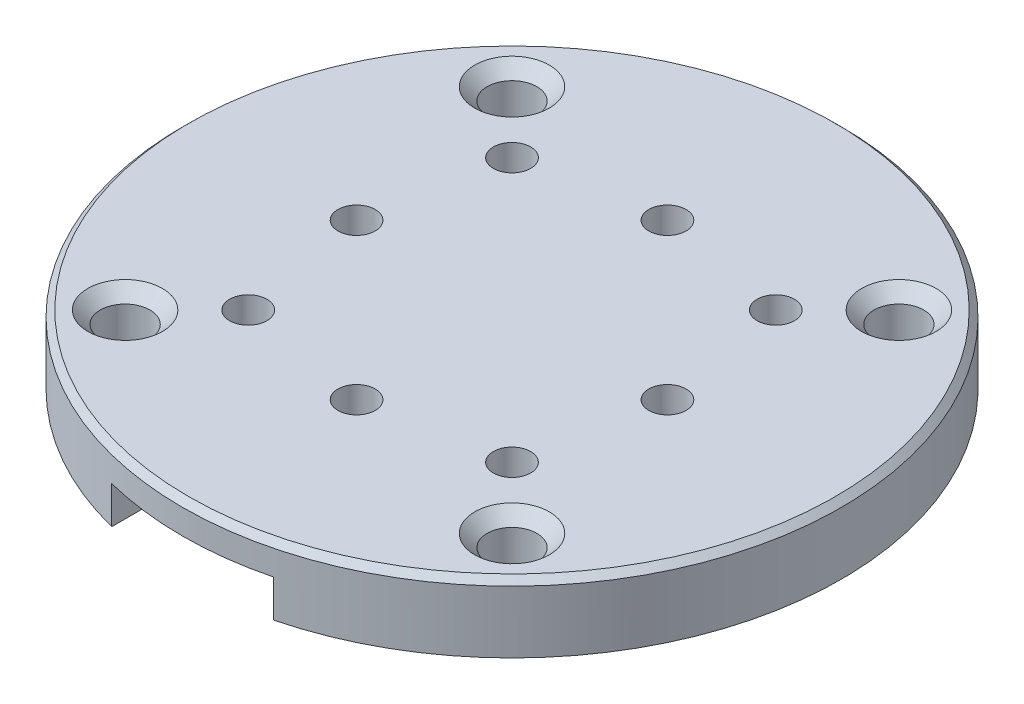
ISO-10303-21;
HEADER;
FILE_DESCRIPTION(('STEP AP214'),'2;1');
FILE_NAME('part.step','',(''),(''),'','','');
FILE_SCHEMA(('AUTOMOTIVE_DESIGN { 1 0 10303 214 1 1 1 1 }'));
ENDSEC;
DATA;
#1=APPLICATION_CONTEXT('core data for automotive mechanical design processes');
#2=APPLICATION_PROTOCOL_DEFINITION('international standard','automotive_design',2000,#1);
#3=PRODUCT_CONTEXT('',#1,'mechanical');
#4=PRODUCT('Part','Part','',(#3));
#5=PRODUCT_RELATED_PRODUCT_CATEGORY('part','',(#4));
#6=PRODUCT_DEFINITION_FORMATION('','',#4);
#7=PRODUCT_DEFINITION_CONTEXT('part definition',#1,'design');
#8=PRODUCT_DEFINITION('design','',#6,#7);
#9=PRODUCT_DEFINITION_SHAPE('','',#8);
#10=(LENGTH_UNIT() NAMED_UNIT(*) SI_UNIT(.MILLI.,.METRE.));
#11=(NAMED_UNIT(*) PLANE_ANGLE_UNIT() SI_UNIT($,.RADIAN.));
#12=(NAMED_UNIT(*) SI_UNIT($,.STERADIAN.) SOLID_ANGLE_UNIT());
#13=UNCERTAINTY_MEASURE_WITH_UNIT(LENGTH_MEASURE(1.E-05),#10,'distance_accuracy_value','');
#14=(GEOMETRIC_REPRESENTATION_CONTEXT(3) GLOBAL_UNCERTAINTY_ASSIGNED_CONTEXT((#13)) GLOBAL_UNIT_ASSIGNED_CONTEXT((#10,
#11,#12)) REPRESENTATION_CONTEXT('',''));
#15=CARTESIAN_POINT('',(0.,0.,0.));
#16=DIRECTION('',(0.,0.,1.));
#17=DIRECTION('',(1.,0.,0.));
#18=AXIS2_PLACEMENT_3D('',#15,#16,#17);
#19=CARTESIAN_POINT('',(0.,0.,12.5));
#20=DIRECTION('',(0.,1.,0.));
#21=DIRECTION('',(0.,0.,1.));
#22=AXIS2_PLACEMENT_3D('',#19,#20,#21);
#23=CYLINDRICAL_SURFACE('',#22,1.5);
#24=CARTESIAN_POINT('',(0.,5.5,12.5));
#25=DIRECTION('',(0.,1.,0.));
#26=DIRECTION('',(0.,0.,1.));
#27=AXIS2_PLACEMENT_3D('',#24,#25,#26);
#28=CIRCLE('',#27,1.5);
#29=CARTESIAN_POINT('',(0.,5.5,14.));
#30=VERTEX_POINT('',#29);
#31=EDGE_CURVE('E125',#30,#30,#28,.T.);
#32=ORIENTED_EDGE('',*,*,#31,.T.);
#33=EDGE_LOOP('',(#32));
#34=FACE_BOUND('',#33,.T.);
#35=CARTESIAN_POINT('',(0.,3.,12.5));
#36=DIRECTION('',(0.,-1.,0.));
#37=DIRECTION('',(0.,0.,-1.));
#38=AXIS2_PLACEMENT_3D('',#35,#36,#37);
#39=CIRCLE('',#38,1.5);
#40=CARTESIAN_POINT('',(0.,3.,11.));
#41=VERTEX_POINT('',#40);
#42=EDGE_CURVE('E43',#41,#41,#39,.F.);
#43=ORIENTED_EDGE('',*,*,#42,.F.);
#44=EDGE_LOOP('',(#43));
#45=FACE_BOUND('',#44,.T.);
#46=ADVANCED_FACE('F39',(#34,#45),#23,.F.);
#47=CARTESIAN_POINT('',(0.,5.5,0.));
#48=DIRECTION('',(0.,-1.,0.));
#49=DIRECTION('',(0.,0.,-1.));
#50=AXIS2_PLACEMENT_3D('',#47,#48,#49);
#51=CYLINDRICAL_SURFACE('',#50,26.5);
#52=CARTESIAN_POINT('',(0.,0.,0.));
#53=DIRECTION('',(0.,1.,0.));
#54=DIRECTION('',(0.,0.,1.));
#55=AXIS2_PLACEMENT_3D('',#52,#53,#54);
#56=CIRCLE('',#55,26.5);
#57=CARTESIAN_POINT('',(6.5,0.,25.6904651573303));
#58=VERTEX_POINT('',#57);
#59=CARTESIAN_POINT('',(-6.5,0.,25.6904651573303));
#60=VERTEX_POINT('',#59);
#61=EDGE_CURVE('E176',#58,#60,#56,.T.);
#62=ORIENTED_EDGE('',*,*,#61,.T.);
#63=DIRECTION('',(0.,-1.,0.));
#64=VECTOR('',#63,1.);
#65=CARTESIAN_POINT('',(-6.5,3.,25.6904651573303));
#66=LINE('',#65,#64);
#67=CARTESIAN_POINT('',(-6.5,3.,25.6904651573303));
#68=VERTEX_POINT('',#67);
#69=EDGE_CURVE('E94',#68,#60,#66,.T.);
#70=ORIENTED_EDGE('',*,*,#69,.F.);
#71=CARTESIAN_POINT('',(0.,3.,0.));
#72=DIRECTION('',(0.,-1.,0.));
#73=DIRECTION('',(0.,0.,-1.));
#74=AXIS2_PLACEMENT_3D('',#71,#72,#73);
#75=CIRCLE('',#74,26.5);
#76=CARTESIAN_POINT('',(6.5,3.,25.6904651573303));
#77=VERTEX_POINT('',#76);
#78=EDGE_CURVE('E100',#77,#68,#75,.T.);
#79=ORIENTED_EDGE('',*,*,#78,.F.);
#80=DIRECTION('',(0.,-1.,0.));
#81=VECTOR('',#80,1.);
#82=CARTESIAN_POINT('',(6.5,3.,25.6904651573303));
#83=LINE('',#82,#81);
#84=EDGE_CURVE('E83',#77,#58,#83,.T.);
#85=ORIENTED_EDGE('',*,*,#84,.T.);
#86=EDGE_LOOP('',(#62,#70,#79,#85));
#87=FACE_BOUND('',#86,.T.);
#88=CARTESIAN_POINT('',(0.,4.99999999999998,0.));
#89=DIRECTION('',(0.,1.,0.));
#90=DIRECTION('',(0.,0.,1.));
#91=AXIS2_PLACEMENT_3D('',#88,#89,#90);
#92=CIRCLE('',#91,26.5);
#93=CARTESIAN_POINT('',(0.,4.99999999999998,26.5));
#94=VERTEX_POINT('',#93);
#95=EDGE_CURVE('E181',#94,#94,#92,.F.);
#96=ORIENTED_EDGE('',*,*,#95,.T.);
#97=EDGE_LOOP('',(#96));
#98=FACE_BOUND('',#97,.T.);
#99=ADVANCED_FACE('F104',(#87,#98),#51,.T.);
#100=CARTESIAN_POINT('',(0.,5.5,0.));
#101=DIRECTION('',(0.,1.,0.));
#102=DIRECTION('',(0.,0.,1.));
#103=AXIS2_PLACEMENT_3D('',#100,#101,#102);
#104=PLANE('',#103);
#105=CARTESIAN_POINT('',(10.6066017177982,5.5,-10.6066017177982));
#106=DIRECTION('',(0.,1.,0.));
#107=DIRECTION('',(0.,0.,1.));
#108=AXIS2_PLACEMENT_3D('',#105,#106,#107);
#109=CIRCLE('',#108,1.5);
#110=CARTESIAN_POINT('',(10.6066017177982,5.5,-9.10660171779819));
#111=VERTEX_POINT('',#110);
#112=EDGE_CURVE('E139',#111,#111,#109,.T.);
#113=ORIENTED_EDGE('',*,*,#112,.F.);
#114=EDGE_LOOP('',(#113));
#115=FACE_BOUND('',#114,.T.);
#116=CARTESIAN_POINT('',(10.6066017177982,5.5,10.6066017177982));
#117=DIRECTION('',(0.,1.,0.));
#118=DIRECTION('',(0.,0.,1.));
#119=AXIS2_PLACEMENT_3D('',#116,#117,#118);
#120=CIRCLE('',#119,1.49999999999964);
#121=CARTESIAN_POINT('',(10.6066017177982,5.5,12.1066017177979));
#122=VERTEX_POINT('',#121);
#123=EDGE_CURVE('E145',#122,#122,#120,.T.);
#124=ORIENTED_EDGE('',*,*,#123,.F.);
#125=EDGE_LOOP('',(#124));
#126=FACE_BOUND('',#125,.T.);
#127=CARTESIAN_POINT('',(-10.6066017177982,5.5,10.6066017177982));
#128=DIRECTION('',(0.,1.,0.));
#129=DIRECTION('',(0.,0.,1.));
#130=AXIS2_PLACEMENT_3D('',#127,#128,#129);
#131=CIRCLE('',#130,1.49999999999898);
#132=CARTESIAN_POINT('',(-10.6066017177982,5.5,12.1066017177972));
#133=VERTEX_POINT('',#132);
#134=EDGE_CURVE('E151',#133,#133,#131,.T.);
#135=ORIENTED_EDGE('',*,*,#134,.F.);
#136=EDGE_LOOP('',(#135));
#137=FACE_BOUND('',#136,.T.);
#138=CARTESIAN_POINT('',(-10.6066017177982,5.5,-10.6066017177982));
#139=DIRECTION('',(0.,1.,0.));
#140=DIRECTION('',(0.,0.,1.));
#141=AXIS2_PLACEMENT_3D('',#138,#139,#140);
#142=CIRCLE('',#141,1.49999999999933);
#143=CARTESIAN_POINT('',(-10.6066017177982,5.5,-9.10660171779889));
#144=VERTEX_POINT('',#143);
#145=EDGE_CURVE('E121',#144,#144,#142,.T.);
#146=ORIENTED_EDGE('',*,*,#145,.F.);
#147=EDGE_LOOP('',(#146));
#148=FACE_BOUND('',#147,.T.);
#149=CARTESIAN_POINT('',(12.5,5.5,0.));
#150=DIRECTION('',(0.,1.,0.));
#151=DIRECTION('',(0.,0.,1.));
#152=AXIS2_PLACEMENT_3D('',#149,#150,#151);
#153=CIRCLE('',#152,1.5);
#154=CARTESIAN_POINT('',(12.5,5.5,1.5));
#155=VERTEX_POINT('',#154);
#156=EDGE_CURVE('E122',#155,#155,#153,.T.);
#157=ORIENTED_EDGE('',*,*,#156,.F.);
#158=EDGE_LOOP('',(#157));
#159=FACE_BOUND('',#158,.T.);
#160=ORIENTED_EDGE('',*,*,#31,.F.);
#161=EDGE_LOOP('',(#160));
#162=FACE_BOUND('',#161,.T.);
#163=CARTESIAN_POINT('',(-12.5,5.5,0.));
#164=DIRECTION('',(0.,1.,0.));
#165=DIRECTION('',(0.,0.,1.));
#166=AXIS2_PLACEMENT_3D('',#163,#164,#165);
#167=CIRCLE('',#166,1.5);
#168=CARTESIAN_POINT('',(-12.5,5.5,1.50000000000001));
#169=VERTEX_POINT('',#168);
#170=EDGE_CURVE('E132',#169,#169,#167,.T.);
#171=ORIENTED_EDGE('',*,*,#170,.F.);
#172=EDGE_LOOP('',(#171));
#173=FACE_BOUND('',#172,.T.);
#174=CARTESIAN_POINT('',(0.,5.5,-12.5));
#175=DIRECTION('',(0.,1.,0.));
#176=DIRECTION('',(0.,0.,1.));
#177=AXIS2_PLACEMENT_3D('',#174,#175,#176);
#178=CIRCLE('',#177,1.5);
#179=CARTESIAN_POINT('',(0.,5.5,-11.));
#180=VERTEX_POINT('',#179);
#181=EDGE_CURVE('E138',#180,#180,#178,.T.);
#182=ORIENTED_EDGE('',*,*,#181,.F.);
#183=EDGE_LOOP('',(#182));
#184=FACE_BOUND('',#183,.T.);
#185=CARTESIAN_POINT('',(-15.556349186104,5.5,15.5563491861041));
#186=DIRECTION('',(0.,1.,0.));
#187=DIRECTION('',(0.,0.,1.));
#188=AXIS2_PLACEMENT_3D('',#185,#186,#187);
#189=CIRCLE('',#188,3.);
#190=CARTESIAN_POINT('',(-15.556349186104,5.5,18.5563491861041));
#191=VERTEX_POINT('',#190);
#192=EDGE_CURVE('E196',#191,#191,#189,.F.);
#193=ORIENTED_EDGE('',*,*,#192,.T.);
#194=EDGE_LOOP('',(#193));
#195=FACE_BOUND('',#194,.T.);
#196=CARTESIAN_POINT('',(15.5563491861041,5.5,15.556349186104));
#197=DIRECTION('',(0.,1.,0.));
#198=DIRECTION('',(0.,0.,1.));
#199=AXIS2_PLACEMENT_3D('',#196,#197,#198);
#200=CIRCLE('',#199,3.);
#201=CARTESIAN_POINT('',(15.5563491861041,5.5,18.556349186104));
#202=VERTEX_POINT('',#201);
#203=EDGE_CURVE('E193',#202,#202,#200,.F.);
#204=ORIENTED_EDGE('',*,*,#203,.T.);
#205=EDGE_LOOP('',(#204));
#206=FACE_BOUND('',#205,.T.);
#207=CARTESIAN_POINT('',(15.556349186104,5.5,-15.5563491861041));
#208=DIRECTION('',(0.,1.,0.));
#209=DIRECTION('',(0.,0.,1.));
#210=AXIS2_PLACEMENT_3D('',#207,#208,#209);
#211=CIRCLE('',#210,3.);
#212=CARTESIAN_POINT('',(15.556349186104,5.5,-12.5563491861041));
#213=VERTEX_POINT('',#212);
#214=EDGE_CURVE('E190',#213,#213,#211,.F.);
#215=ORIENTED_EDGE('',*,*,#214,.T.);
#216=EDGE_LOOP('',(#215));
#217=FACE_BOUND('',#216,.T.);
#218=CARTESIAN_POINT('',(-15.5563491861041,5.5,-15.556349186104));
#219=DIRECTION('',(0.,1.,0.));
#220=DIRECTION('',(0.,0.,1.));
#221=AXIS2_PLACEMENT_3D('',#218,#219,#220);
#222=CIRCLE('',#221,3.);
#223=CARTESIAN_POINT('',(-15.5563491861041,5.5,-12.556349186104));
#224=VERTEX_POINT('',#223);
#225=EDGE_CURVE('E187',#224,#224,#222,.F.);
#226=ORIENTED_EDGE('',*,*,#225,.T.);
#227=EDGE_LOOP('',(#226));
#228=FACE_BOUND('',#227,.T.);
#229=CARTESIAN_POINT('',(0.,5.5,0.));
#230=DIRECTION('',(0.,1.,0.));
#231=DIRECTION('',(0.,0.,1.));
#232=AXIS2_PLACEMENT_3D('',#229,#230,#231);
#233=CIRCLE('',#232,26.);
#234=CARTESIAN_POINT('',(0.,5.5,26.));
#235=VERTEX_POINT('',#234);
#236=EDGE_CURVE('E178',#235,#235,#233,.T.);
#237=ORIENTED_EDGE('',*,*,#236,.T.);
#238=EDGE_LOOP('',(#237));
#239=FACE_BOUND('',#238,.T.);
#240=ADVANCED_FACE('F228',(#115,#126,#137,#148,#159,#162,#173,#184,#195,#206,#217,#228,#239),
#104,.T.);
#241=CARTESIAN_POINT('',(0.,0.,0.));
#242=DIRECTION('',(0.,1.,0.));
#243=DIRECTION('',(0.,0.,1.));
#244=AXIS2_PLACEMENT_3D('',#241,#242,#243);
#245=PLANE('',#244);
#246=CARTESIAN_POINT('',(10.6066017177982,0.,-10.6066017177982));
#247=DIRECTION('',(0.,1.,0.));
#248=DIRECTION('',(0.,0.,1.));
#249=AXIS2_PLACEMENT_3D('',#246,#247,#248);
#250=CIRCLE('',#249,1.5);
#251=CARTESIAN_POINT('',(10.6066017177982,0.,-9.10660171779819));
#252=VERTEX_POINT('',#251);
#253=EDGE_CURVE('E135',#252,#252,#250,.T.);
#254=ORIENTED_EDGE('',*,*,#253,.T.);
#255=EDGE_LOOP('',(#254));
#256=FACE_BOUND('',#255,.T.);
#257=CARTESIAN_POINT('',(10.6066017177982,0.,10.6066017177982));
#258=DIRECTION('',(0.,1.,0.));
#259=DIRECTION('',(0.,0.,1.));
#260=AXIS2_PLACEMENT_3D('',#257,#258,#259);
#261=CIRCLE('',#260,1.49999999999964);
#262=CARTESIAN_POINT('',(10.6066017177982,0.,12.1066017177979));
#263=VERTEX_POINT('',#262);
#264=EDGE_CURVE('E142',#263,#263,#261,.T.);
#265=ORIENTED_EDGE('',*,*,#264,.T.);
#266=EDGE_LOOP('',(#265));
#267=FACE_BOUND('',#266,.T.);
#268=CARTESIAN_POINT('',(-10.6066017177982,0.,10.6066017177982));
#269=DIRECTION('',(0.,1.,0.));
#270=DIRECTION('',(0.,0.,1.));
#271=AXIS2_PLACEMENT_3D('',#268,#269,#270);
#272=CIRCLE('',#271,1.49999999999898);
#273=CARTESIAN_POINT('',(-10.6066017177982,0.,12.1066017177972));
#274=VERTEX_POINT('',#273);
#275=EDGE_CURVE('E148',#274,#274,#272,.T.);
#276=ORIENTED_EDGE('',*,*,#275,.T.);
#277=EDGE_LOOP('',(#276));
#278=FACE_BOUND('',#277,.T.);
#279=CARTESIAN_POINT('',(-10.6066017177982,0.,-10.6066017177982));
#280=DIRECTION('',(0.,1.,0.));
#281=DIRECTION('',(0.,0.,1.));
#282=AXIS2_PLACEMENT_3D('',#279,#280,#281);
#283=CIRCLE('',#282,1.49999999999933);
#284=CARTESIAN_POINT('',(-10.6066017177982,0.,-9.10660171779889));
#285=VERTEX_POINT('',#284);
#286=EDGE_CURVE('E154',#285,#285,#283,.T.);
#287=ORIENTED_EDGE('',*,*,#286,.T.);
#288=EDGE_LOOP('',(#287));
#289=FACE_BOUND('',#288,.T.);
#290=CARTESIAN_POINT('',(12.5,0.,0.));
#291=DIRECTION('',(0.,1.,0.));
#292=DIRECTION('',(0.,0.,1.));
#293=AXIS2_PLACEMENT_3D('',#290,#291,#292);
#294=CIRCLE('',#293,1.5);
#295=CARTESIAN_POINT('',(12.5,0.,1.5));
#296=VERTEX_POINT('',#295);
#297=EDGE_CURVE('E118',#296,#296,#294,.T.);
#298=ORIENTED_EDGE('',*,*,#297,.T.);
#299=EDGE_LOOP('',(#298));
#300=FACE_BOUND('',#299,.T.);
#301=CARTESIAN_POINT('',(-12.5,0.,0.));
#302=DIRECTION('',(0.,1.,0.));
#303=DIRECTION('',(0.,0.,1.));
#304=AXIS2_PLACEMENT_3D('',#301,#302,#303);
#305=CIRCLE('',#304,1.5);
#306=CARTESIAN_POINT('',(-12.5,0.,1.50000000000001));
#307=VERTEX_POINT('',#306);
#308=EDGE_CURVE('E129',#307,#307,#305,.T.);
#309=ORIENTED_EDGE('',*,*,#308,.T.);
#310=EDGE_LOOP('',(#309));
#311=FACE_BOUND('',#310,.T.);
#312=CARTESIAN_POINT('',(0.,0.,-12.5));
#313=DIRECTION('',(0.,1.,0.));
#314=DIRECTION('',(0.,0.,1.));
#315=AXIS2_PLACEMENT_3D('',#312,#313,#314);
#316=CIRCLE('',#315,1.5);
#317=CARTESIAN_POINT('',(0.,0.,-11.));
#318=VERTEX_POINT('',#317);
#319=EDGE_CURVE('E159',#318,#318,#316,.T.);
#320=ORIENTED_EDGE('',*,*,#319,.T.);
#321=EDGE_LOOP('',(#320));
#322=FACE_BOUND('',#321,.T.);
#323=CARTESIAN_POINT('',(-15.556349186104,0.,15.5563491861041));
#324=DIRECTION('',(0.,1.,0.));
#325=DIRECTION('',(0.,0.,1.));
#326=AXIS2_PLACEMENT_3D('',#323,#324,#325);
#327=CIRCLE('',#326,2.);
#328=CARTESIAN_POINT('',(-15.556349186104,0.,17.5563491861041));
#329=VERTEX_POINT('',#328);
#330=EDGE_CURVE('E162',#329,#329,#327,.T.);
#331=ORIENTED_EDGE('',*,*,#330,.T.);
#332=EDGE_LOOP('',(#331));
#333=FACE_BOUND('',#332,.T.);
#334=CARTESIAN_POINT('',(15.5563491861041,0.,15.556349186104));
#335=DIRECTION('',(0.,1.,0.));
#336=DIRECTION('',(0.,0.,1.));
#337=AXIS2_PLACEMENT_3D('',#334,#335,#336);
#338=CIRCLE('',#337,2.);
#339=CARTESIAN_POINT('',(15.5563491861041,0.,17.556349186104));
#340=VERTEX_POINT('',#339);
#341=EDGE_CURVE('E169',#340,#340,#338,.T.);
#342=ORIENTED_EDGE('',*,*,#341,.T.);
#343=EDGE_LOOP('',(#342));
#344=FACE_BOUND('',#343,.T.);
#345=CARTESIAN_POINT('',(15.556349186104,0.,-15.5563491861041));
#346=DIRECTION('',(0.,1.,0.));
#347=DIRECTION('',(0.,0.,1.));
#348=AXIS2_PLACEMENT_3D('',#345,#346,#347);
#349=CIRCLE('',#348,2.);
#350=CARTESIAN_POINT('',(15.556349186104,0.,-13.5563491861041));
#351=VERTEX_POINT('',#350);
#352=EDGE_CURVE('E165',#351,#351,#349,.T.);
#353=ORIENTED_EDGE('',*,*,#352,.T.);
#354=EDGE_LOOP('',(#353));
#355=FACE_BOUND('',#354,.T.);
#356=CARTESIAN_POINT('',(-15.5563491861041,0.,-15.556349186104));
#357=DIRECTION('',(0.,1.,0.));
#358=DIRECTION('',(0.,0.,1.));
#359=AXIS2_PLACEMENT_3D('',#356,#357,#358);
#360=CIRCLE('',#359,2.);
#361=CARTESIAN_POINT('',(-15.5563491861041,0.,-13.556349186104));
#362=VERTEX_POINT('',#361);
#363=EDGE_CURVE('E168',#362,#362,#360,.T.);
#364=ORIENTED_EDGE('',*,*,#363,.T.);
#365=EDGE_LOOP('',(#364));
#366=FACE_BOUND('',#365,.T.);
#367=CARTESIAN_POINT('',(0.,0.,0.));
#368=DIRECTION('',(0.,-1.,0.));
#369=DIRECTION('',(0.,0.,-1.));
#370=AXIS2_PLACEMENT_3D('',#367,#368,#369);
#371=CIRCLE('',#370,9.5);
#372=CARTESIAN_POINT('',(-6.5,0.,6.92820323027551));
#373=VERTEX_POINT('',#372);
#374=CARTESIAN_POINT('',(6.5,0.,6.92820323027551));
#375=VERTEX_POINT('',#374);
#376=EDGE_CURVE('E55',#373,#375,#371,.T.);
#377=ORIENTED_EDGE('',*,*,#376,.F.);
#378=DIRECTION('',(0.,0.,-1.));
#379=VECTOR('',#378,1.);
#380=CARTESIAN_POINT('',(-6.5,0.,6.92820323027551));
#381=LINE('',#380,#379);
#382=EDGE_CURVE('E113',#60,#373,#381,.T.);
#383=ORIENTED_EDGE('',*,*,#382,.F.);
#384=ORIENTED_EDGE('',*,*,#61,.F.);
#385=DIRECTION('',(0.,0.,1.));
#386=VECTOR('',#385,1.);
#387=CARTESIAN_POINT('',(6.5,0.,6.92820323027551));
#388=LINE('',#387,#386);
#389=EDGE_CURVE('E89',#375,#58,#388,.T.);
#390=ORIENTED_EDGE('',*,*,#389,.F.);
#391=EDGE_LOOP('',(#377,#383,#384,#390));
#392=FACE_BOUND('',#391,.T.);
#393=ADVANCED_FACE('F275',(#256,#267,#278,#289,#300,#311,#322,#333,#344,#355,#366,#392),#245,.F.);
#394=CARTESIAN_POINT('',(0.,5.5,0.));
#395=DIRECTION('',(0.,-1.,0.));
#396=DIRECTION('',(0.,0.,-1.));
#397=AXIS2_PLACEMENT_3D('',#394,#395,#396);
#398=CONICAL_SURFACE('',#397,26.,0.785398163397445);
#399=ORIENTED_EDGE('',*,*,#95,.F.);
#400=EDGE_LOOP('',(#399));
#401=FACE_BOUND('',#400,.T.);
#402=ORIENTED_EDGE('',*,*,#236,.F.);
#403=EDGE_LOOP('',(#402));
#404=FACE_BOUND('',#403,.T.);
#405=ADVANCED_FACE('F271',(#401,#404),#398,.T.);
#406=CARTESIAN_POINT('',(-15.5563491861041,0.,-15.556349186104));
#407=DIRECTION('',(0.,1.,0.));
#408=DIRECTION('',(0.,0.,1.));
#409=AXIS2_PLACEMENT_3D('',#406,#407,#408);
#410=CYLINDRICAL_SURFACE('',#409,2.);
#411=CARTESIAN_POINT('',(-15.5563491861041,4.5,-15.556349186104));
#412=DIRECTION('',(0.,1.,0.));
#413=DIRECTION('',(0.,0.,1.));
#414=AXIS2_PLACEMENT_3D('',#411,#412,#413);
#415=CIRCLE('',#414,2.);
#416=CARTESIAN_POINT('',(-15.5563491861041,4.5,-13.556349186104));
#417=VERTEX_POINT('',#416);
#418=EDGE_CURVE('E11',#417,#417,#415,.T.);
#419=ORIENTED_EDGE('',*,*,#418,.T.);
#420=EDGE_LOOP('',(#419));
#421=FACE_BOUND('',#420,.T.);
#422=ORIENTED_EDGE('',*,*,#363,.F.);
#423=EDGE_LOOP('',(#422));
#424=FACE_BOUND('',#423,.T.);
#425=ADVANCED_FACE('F261',(#421,#424),#410,.F.);
#426=CARTESIAN_POINT('',(15.556349186104,0.,-15.5563491861041));
#427=DIRECTION('',(0.,1.,0.));
#428=DIRECTION('',(0.,0.,1.));
#429=AXIS2_PLACEMENT_3D('',#426,#427,#428);
#430=CYLINDRICAL_SURFACE('',#429,2.);
#431=CARTESIAN_POINT('',(15.556349186104,4.50000000000001,-15.5563491861041));
#432=DIRECTION('',(0.,1.,0.));
#433=DIRECTION('',(0.,0.,1.));
#434=AXIS2_PLACEMENT_3D('',#431,#432,#433);
#435=CIRCLE('',#434,2.);
#436=CARTESIAN_POINT('',(15.556349186104,4.50000000000001,-13.5563491861041));
#437=VERTEX_POINT('',#436);
#438=EDGE_CURVE('E48',#437,#437,#435,.T.);
#439=ORIENTED_EDGE('',*,*,#438,.T.);
#440=EDGE_LOOP('',(#439));
#441=FACE_BOUND('',#440,.T.);
#442=ORIENTED_EDGE('',*,*,#352,.F.);
#443=EDGE_LOOP('',(#442));
#444=FACE_BOUND('',#443,.T.);
#445=ADVANCED_FACE('F205',(#441,#444),#430,.F.);
#446=CARTESIAN_POINT('',(15.5563491861041,0.,15.556349186104));
#447=DIRECTION('',(0.,1.,0.));
#448=DIRECTION('',(0.,0.,1.));
#449=AXIS2_PLACEMENT_3D('',#446,#447,#448);
#450=CYLINDRICAL_SURFACE('',#449,2.);
#451=CARTESIAN_POINT('',(15.5563491861041,4.50000000000001,15.556349186104));
#452=DIRECTION('',(0.,1.,0.));
#453=DIRECTION('',(0.,0.,1.));
#454=AXIS2_PLACEMENT_3D('',#451,#452,#453);
#455=CIRCLE('',#454,2.);
#456=CARTESIAN_POINT('',(15.5563491861041,4.50000000000001,17.556349186104));
#457=VERTEX_POINT('',#456);
#458=EDGE_CURVE('E199',#457,#457,#455,.T.);
#459=ORIENTED_EDGE('',*,*,#458,.T.);
#460=EDGE_LOOP('',(#459));
#461=FACE_BOUND('',#460,.T.);
#462=ORIENTED_EDGE('',*,*,#341,.F.);
#463=EDGE_LOOP('',(#462));
#464=FACE_BOUND('',#463,.T.);
#465=ADVANCED_FACE('F260',(#461,#464),#450,.F.);
#466=CARTESIAN_POINT('',(-15.556349186104,0.,15.5563491861041));
#467=DIRECTION('',(0.,1.,0.));
#468=DIRECTION('',(0.,0.,1.));
#469=AXIS2_PLACEMENT_3D('',#466,#467,#468);
#470=CYLINDRICAL_SURFACE('',#469,2.);
#471=CARTESIAN_POINT('',(-15.556349186104,4.5,15.5563491861041));
#472=DIRECTION('',(0.,1.,0.));
#473=DIRECTION('',(0.,0.,1.));
#474=AXIS2_PLACEMENT_3D('',#471,#472,#473);
#475=CIRCLE('',#474,2.);
#476=CARTESIAN_POINT('',(-15.556349186104,4.5,17.5563491861041));
#477=VERTEX_POINT('',#476);
#478=EDGE_CURVE('E184',#477,#477,#475,.T.);
#479=ORIENTED_EDGE('',*,*,#478,.T.);
#480=EDGE_LOOP('',(#479));
#481=FACE_BOUND('',#480,.T.);
#482=ORIENTED_EDGE('',*,*,#330,.F.);
#483=EDGE_LOOP('',(#482));
#484=FACE_BOUND('',#483,.T.);
#485=ADVANCED_FACE('F264',(#481,#484),#470,.F.);
#486=CARTESIAN_POINT('',(-15.556349186104,4.5,15.5563491861041));
#487=DIRECTION('',(0.,1.,0.));
#488=DIRECTION('',(0.,0.,1.));
#489=AXIS2_PLACEMENT_3D('',#486,#487,#488);
#490=CONICAL_SURFACE('',#489,2.,0.785398163397452);
#491=ORIENTED_EDGE('',*,*,#192,.F.);
#492=EDGE_LOOP('',(#491));
#493=FACE_BOUND('',#492,.T.);
#494=ORIENTED_EDGE('',*,*,#478,.F.);
#495=EDGE_LOOP('',(#494));
#496=FACE_BOUND('',#495,.T.);
#497=ADVANCED_FACE('F218',(#493,#496),#490,.F.);
#498=CARTESIAN_POINT('',(15.5563491861041,4.50000000000001,15.556349186104));
#499=DIRECTION('',(0.,1.,0.));
#500=DIRECTION('',(0.,0.,1.));
#501=AXIS2_PLACEMENT_3D('',#498,#499,#500);
#502=CONICAL_SURFACE('',#501,2.,0.785398163397452);
#503=ORIENTED_EDGE('',*,*,#203,.F.);
#504=EDGE_LOOP('',(#503));
#505=FACE_BOUND('',#504,.T.);
#506=ORIENTED_EDGE('',*,*,#458,.F.);
#507=EDGE_LOOP('',(#506));
#508=FACE_BOUND('',#507,.T.);
#509=ADVANCED_FACE('F210',(#505,#508),#502,.F.);
#510=CARTESIAN_POINT('',(15.556349186104,4.50000000000001,-15.5563491861041));
#511=DIRECTION('',(0.,1.,0.));
#512=DIRECTION('',(0.,0.,1.));
#513=AXIS2_PLACEMENT_3D('',#510,#511,#512);
#514=CONICAL_SURFACE('',#513,2.,0.785398163397452);
#515=ORIENTED_EDGE('',*,*,#214,.F.);
#516=EDGE_LOOP('',(#515));
#517=FACE_BOUND('',#516,.T.);
#518=ORIENTED_EDGE('',*,*,#438,.F.);
#519=EDGE_LOOP('',(#518));
#520=FACE_BOUND('',#519,.T.);
#521=ADVANCED_FACE('F208',(#517,#520),#514,.F.);
#522=CARTESIAN_POINT('',(-15.5563491861041,4.5,-15.556349186104));
#523=DIRECTION('',(0.,1.,0.));
#524=DIRECTION('',(0.,0.,1.));
#525=AXIS2_PLACEMENT_3D('',#522,#523,#524);
#526=CONICAL_SURFACE('',#525,2.,0.785398163397452);
#527=ORIENTED_EDGE('',*,*,#225,.F.);
#528=EDGE_LOOP('',(#527));
#529=FACE_BOUND('',#528,.T.);
#530=ORIENTED_EDGE('',*,*,#418,.F.);
#531=EDGE_LOOP('',(#530));
#532=FACE_BOUND('',#531,.T.);
#533=ADVANCED_FACE('F41',(#529,#532),#526,.F.);
#534=CARTESIAN_POINT('',(0.,0.,-12.5));
#535=DIRECTION('',(0.,1.,0.));
#536=DIRECTION('',(0.,0.,1.));
#537=AXIS2_PLACEMENT_3D('',#534,#535,#536);
#538=CYLINDRICAL_SURFACE('',#537,1.5);
#539=ORIENTED_EDGE('',*,*,#319,.F.);
#540=EDGE_LOOP('',(#539));
#541=FACE_BOUND('',#540,.T.);
#542=ORIENTED_EDGE('',*,*,#181,.T.);
#543=EDGE_LOOP('',(#542));
#544=FACE_BOUND('',#543,.T.);
#545=ADVANCED_FACE('F216',(#541,#544),#538,.F.);
#546=CARTESIAN_POINT('',(-12.5,0.,0.));
#547=DIRECTION('',(0.,1.,0.));
#548=DIRECTION('',(0.,0.,1.));
#549=AXIS2_PLACEMENT_3D('',#546,#547,#548);
#550=CYLINDRICAL_SURFACE('',#549,1.5);
#551=ORIENTED_EDGE('',*,*,#308,.F.);
#552=EDGE_LOOP('',(#551));
#553=FACE_BOUND('',#552,.T.);
#554=ORIENTED_EDGE('',*,*,#170,.T.);
#555=EDGE_LOOP('',(#554));
#556=FACE_BOUND('',#555,.T.);
#557=ADVANCED_FACE('F235',(#553,#556),#550,.F.);
#558=CARTESIAN_POINT('',(12.5,0.,0.));
#559=DIRECTION('',(0.,1.,0.));
#560=DIRECTION('',(0.,0.,1.));
#561=AXIS2_PLACEMENT_3D('',#558,#559,#560);
#562=CYLINDRICAL_SURFACE('',#561,1.5);
#563=ORIENTED_EDGE('',*,*,#297,.F.);
#564=EDGE_LOOP('',(#563));
#565=FACE_BOUND('',#564,.T.);
#566=ORIENTED_EDGE('',*,*,#156,.T.);
#567=EDGE_LOOP('',(#566));
#568=FACE_BOUND('',#567,.T.);
#569=ADVANCED_FACE('F233',(#565,#568),#562,.F.);
#570=CARTESIAN_POINT('',(-10.6066017177982,0.,-10.6066017177982));
#571=DIRECTION('',(0.,1.,0.));
#572=DIRECTION('',(0.,0.,1.));
#573=AXIS2_PLACEMENT_3D('',#570,#571,#572);
#574=CYLINDRICAL_SURFACE('',#573,1.49999999999933);
#575=ORIENTED_EDGE('',*,*,#286,.F.);
#576=EDGE_LOOP('',(#575));
#577=FACE_BOUND('',#576,.T.);
#578=ORIENTED_EDGE('',*,*,#145,.T.);
#579=EDGE_LOOP('',(#578));
#580=FACE_BOUND('',#579,.T.);
#581=ADVANCED_FACE('F250',(#577,#580),#574,.F.);
#582=CARTESIAN_POINT('',(-10.6066017177982,0.,10.6066017177982));
#583=DIRECTION('',(0.,1.,0.));
#584=DIRECTION('',(0.,0.,1.));
#585=AXIS2_PLACEMENT_3D('',#582,#583,#584);
#586=CYLINDRICAL_SURFACE('',#585,1.49999999999898);
#587=ORIENTED_EDGE('',*,*,#275,.F.);
#588=EDGE_LOOP('',(#587));
#589=FACE_BOUND('',#588,.T.);
#590=ORIENTED_EDGE('',*,*,#134,.T.);
#591=EDGE_LOOP('',(#590));
#592=FACE_BOUND('',#591,.T.);
#593=ADVANCED_FACE('F246',(#589,#592),#586,.F.);
#594=CARTESIAN_POINT('',(10.6066017177982,0.,10.6066017177982));
#595=DIRECTION('',(0.,1.,0.));
#596=DIRECTION('',(0.,0.,1.));
#597=AXIS2_PLACEMENT_3D('',#594,#595,#596);
#598=CYLINDRICAL_SURFACE('',#597,1.49999999999964);
#599=ORIENTED_EDGE('',*,*,#264,.F.);
#600=EDGE_LOOP('',(#599));
#601=FACE_BOUND('',#600,.T.);
#602=ORIENTED_EDGE('',*,*,#123,.T.);
#603=EDGE_LOOP('',(#602));
#604=FACE_BOUND('',#603,.T.);
#605=ADVANCED_FACE('F242',(#601,#604),#598,.F.);
#606=CARTESIAN_POINT('',(10.6066017177982,0.,-10.6066017177982));
#607=DIRECTION('',(0.,1.,0.));
#608=DIRECTION('',(0.,0.,1.));
#609=AXIS2_PLACEMENT_3D('',#606,#607,#608);
#610=CYLINDRICAL_SURFACE('',#609,1.5);
#611=ORIENTED_EDGE('',*,*,#253,.F.);
#612=EDGE_LOOP('',(#611));
#613=FACE_BOUND('',#612,.T.);
#614=ORIENTED_EDGE('',*,*,#112,.T.);
#615=EDGE_LOOP('',(#614));
#616=FACE_BOUND('',#615,.T.);
#617=ADVANCED_FACE('F239',(#613,#616),#610,.F.);
#618=CARTESIAN_POINT('',(0.,3.,0.));
#619=DIRECTION('',(0.,-1.,0.));
#620=DIRECTION('',(0.,0.,-1.));
#621=AXIS2_PLACEMENT_3D('',#618,#619,#620);
#622=PLANE('',#621);
#623=CARTESIAN_POINT('',(0.,3.,0.));
#624=DIRECTION('',(0.,-1.,0.));
#625=DIRECTION('',(0.,0.,-1.));
#626=AXIS2_PLACEMENT_3D('',#623,#624,#625);
#627=CIRCLE('',#626,9.5);
#628=CARTESIAN_POINT('',(-6.5,3.,6.92820323027551));
#629=VERTEX_POINT('',#628);
#630=CARTESIAN_POINT('',(6.5,3.,6.92820323027551));
#631=VERTEX_POINT('',#630);
#632=EDGE_CURVE('E101',#629,#631,#627,.T.);
#633=ORIENTED_EDGE('',*,*,#632,.T.);
#634=DIRECTION('',(0.,0.,1.));
#635=VECTOR('',#634,1.);
#636=CARTESIAN_POINT('',(6.5,3.,6.92820323027551));
#637=LINE('',#636,#635);
#638=EDGE_CURVE('E86',#631,#77,#637,.T.);
#639=ORIENTED_EDGE('',*,*,#638,.T.);
#640=ORIENTED_EDGE('',*,*,#78,.T.);
#641=DIRECTION('',(0.,0.,-1.));
#642=VECTOR('',#641,1.);
#643=CARTESIAN_POINT('',(-6.5,3.,6.92820323027551));
#644=LINE('',#643,#642);
#645=EDGE_CURVE('E106',#68,#629,#644,.T.);
#646=ORIENTED_EDGE('',*,*,#645,.T.);
#647=EDGE_LOOP('',(#633,#639,#640,#646));
#648=FACE_BOUND('',#647,.T.);
#649=ORIENTED_EDGE('',*,*,#42,.T.);
#650=EDGE_LOOP('',(#649));
#651=FACE_BOUND('',#650,.T.);
#652=ADVANCED_FACE('F97',(#648,#651),#622,.T.);
#653=CARTESIAN_POINT('',(0.,3.,0.));
#654=DIRECTION('',(0.,-1.,0.));
#655=DIRECTION('',(0.,0.,-1.));
#656=AXIS2_PLACEMENT_3D('',#653,#654,#655);
#657=CYLINDRICAL_SURFACE('',#656,9.5);
#658=ORIENTED_EDGE('',*,*,#376,.T.);
#659=DIRECTION('',(0.,-1.,0.));
#660=VECTOR('',#659,1.);
#661=CARTESIAN_POINT('',(6.5,3.,6.92820323027551));
#662=LINE('',#661,#660);
#663=EDGE_CURVE('E78',#631,#375,#662,.T.);
#664=ORIENTED_EDGE('',*,*,#663,.F.);
#665=ORIENTED_EDGE('',*,*,#632,.F.);
#666=DIRECTION('',(0.,-1.,0.));
#667=VECTOR('',#666,1.);
#668=CARTESIAN_POINT('',(-6.5,3.,6.92820323027551));
#669=LINE('',#668,#667);
#670=EDGE_CURVE('E63',#629,#373,#669,.T.);
#671=ORIENTED_EDGE('',*,*,#670,.T.);
#672=EDGE_LOOP('',(#658,#664,#665,#671));
#673=FACE_BOUND('',#672,.T.);
#674=ADVANCED_FACE('F303',(#673),#657,.F.);
#675=CARTESIAN_POINT('',(-6.5,3.,6.92820323027551));
#676=DIRECTION('',(-1.,0.,0.));
#677=DIRECTION('',(0.,0.,1.));
#678=AXIS2_PLACEMENT_3D('',#675,#676,#677);
#679=PLANE('',#678);
#680=ORIENTED_EDGE('',*,*,#382,.T.);
#681=ORIENTED_EDGE('',*,*,#670,.F.);
#682=ORIENTED_EDGE('',*,*,#645,.F.);
#683=ORIENTED_EDGE('',*,*,#69,.T.);
#684=EDGE_LOOP('',(#680,#681,#682,#683));
#685=FACE_BOUND('',#684,.T.);
#686=ADVANCED_FACE('F301',(#685),#679,.F.);
#687=CARTESIAN_POINT('',(6.5,3.,6.92820323027551));
#688=DIRECTION('',(1.,0.,0.));
#689=DIRECTION('',(0.,0.,-1.));
#690=AXIS2_PLACEMENT_3D('',#687,#688,#689);
#691=PLANE('',#690);
#692=ORIENTED_EDGE('',*,*,#389,.T.);
#693=ORIENTED_EDGE('',*,*,#84,.F.);
#694=ORIENTED_EDGE('',*,*,#638,.F.);
#695=ORIENTED_EDGE('',*,*,#663,.T.);
#696=EDGE_LOOP('',(#692,#693,#694,#695));
#697=FACE_BOUND('',#696,.T.);
#698=ADVANCED_FACE('F85',(#697),#691,.F.);
#699=CLOSED_SHELL('',(#46,#99,#240,#393,#405,#425,#445,#465,#485,#497,#509,#521,#533,#545,#557,
#569,#581,#593,#605,#617,#652,#674,#686,#698));
#700=MANIFOLD_SOLID_BREP('B2',#699);
#701=ADVANCED_BREP_SHAPE_REPRESENTATION('',(#18,#700),#14);
#702=SHAPE_DEFINITION_REPRESENTATION(#9,#701);
ENDSEC;
END-ISO-10303-21;
